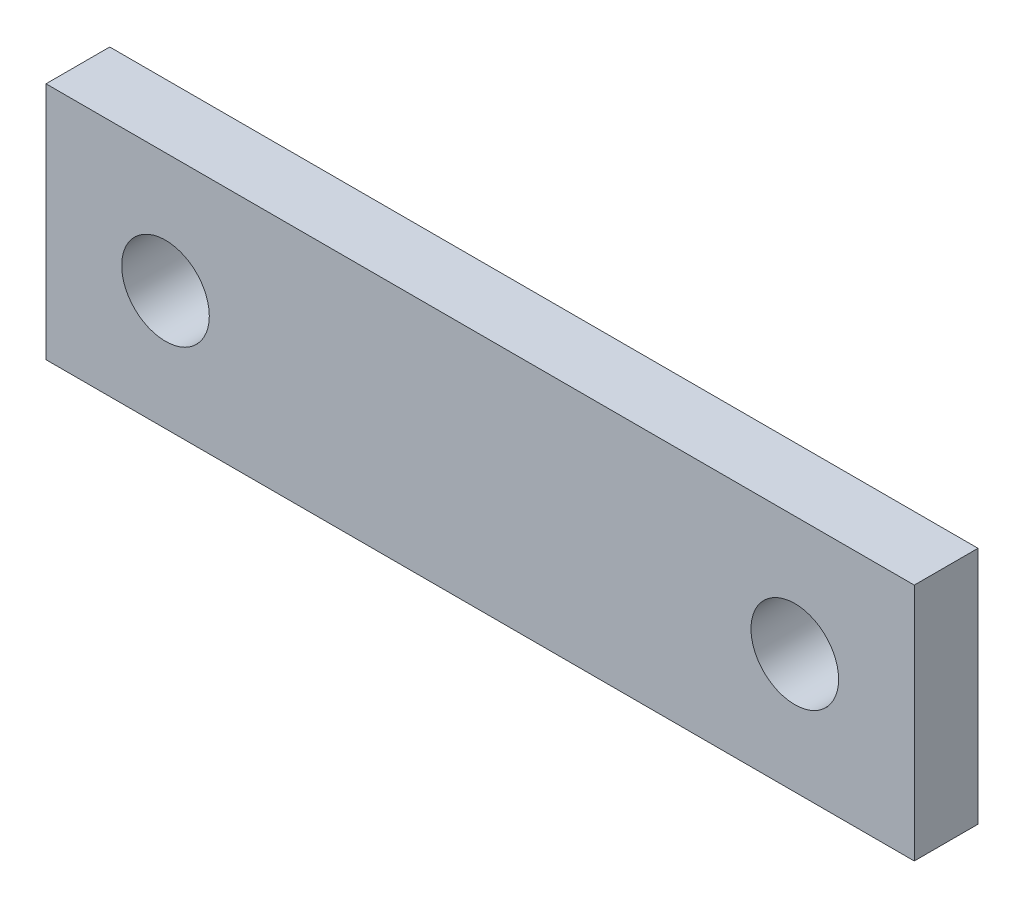
ISO-10303-21;
HEADER;
FILE_DESCRIPTION(('STEP AP214'),'2;1');
FILE_NAME('part.step','',(''),(''),'','','');
FILE_SCHEMA(('AUTOMOTIVE_DESIGN { 1 0 10303 214 1 1 1 1 }'));
ENDSEC;
DATA;
#1=APPLICATION_CONTEXT('core data for automotive mechanical design processes');
#2=APPLICATION_PROTOCOL_DEFINITION('international standard','automotive_design',2000,#1);
#3=PRODUCT_CONTEXT('',#1,'mechanical');
#4=PRODUCT('Part','Part','',(#3));
#5=PRODUCT_RELATED_PRODUCT_CATEGORY('part','',(#4));
#6=PRODUCT_DEFINITION_FORMATION('','',#4);
#7=PRODUCT_DEFINITION_CONTEXT('part definition',#1,'design');
#8=PRODUCT_DEFINITION('design','',#6,#7);
#9=PRODUCT_DEFINITION_SHAPE('','',#8);
#10=(LENGTH_UNIT() NAMED_UNIT(*) SI_UNIT(.MILLI.,.METRE.));
#11=(NAMED_UNIT(*) PLANE_ANGLE_UNIT() SI_UNIT($,.RADIAN.));
#12=(NAMED_UNIT(*) SI_UNIT($,.STERADIAN.) SOLID_ANGLE_UNIT());
#13=UNCERTAINTY_MEASURE_WITH_UNIT(LENGTH_MEASURE(1.E-05),#10,'distance_accuracy_value','');
#14=(GEOMETRIC_REPRESENTATION_CONTEXT(3) GLOBAL_UNCERTAINTY_ASSIGNED_CONTEXT((#13)) GLOBAL_UNIT_ASSIGNED_CONTEXT((#10,
#11,#12)) REPRESENTATION_CONTEXT('',''));
#15=CARTESIAN_POINT('',(0.,0.,0.));
#16=DIRECTION('',(0.,0.,1.));
#17=DIRECTION('',(1.,0.,0.));
#18=AXIS2_PLACEMENT_3D('',#15,#16,#17);
#19=CARTESIAN_POINT('',(0.,0.,16.));
#20=DIRECTION('',(1.,0.,0.));
#21=DIRECTION('',(0.,0.,-1.));
#22=AXIS2_PLACEMENT_3D('',#19,#20,#21);
#23=PLANE('',#22);
#24=DIRECTION('',(0.,-1.,0.));
#25=VECTOR('',#24,1.);
#26=CARTESIAN_POINT('',(0.,0.,0.));
#27=LINE('',#26,#25);
#28=CARTESIAN_POINT('',(0.,60.,0.));
#29=VERTEX_POINT('',#28);
#30=CARTESIAN_POINT('',(0.,0.,0.));
#31=VERTEX_POINT('',#30);
#32=EDGE_CURVE('E97',#29,#31,#27,.T.);
#33=ORIENTED_EDGE('',*,*,#32,.T.);
#34=DIRECTION('',(0.,0.,-1.));
#35=VECTOR('',#34,1.);
#36=CARTESIAN_POINT('',(0.,0.,16.));
#37=LINE('',#36,#35);
#38=CARTESIAN_POINT('',(0.,0.,16.));
#39=VERTEX_POINT('',#38);
#40=EDGE_CURVE('E11',#39,#31,#37,.T.);
#41=ORIENTED_EDGE('',*,*,#40,.F.);
#42=DIRECTION('',(0.,-1.,0.));
#43=VECTOR('',#42,1.);
#44=CARTESIAN_POINT('',(0.,0.,16.));
#45=LINE('',#44,#43);
#46=CARTESIAN_POINT('',(0.,60.,16.));
#47=VERTEX_POINT('',#46);
#48=EDGE_CURVE('E85',#47,#39,#45,.T.);
#49=ORIENTED_EDGE('',*,*,#48,.F.);
#50=DIRECTION('',(0.,0.,-1.));
#51=VECTOR('',#50,1.);
#52=CARTESIAN_POINT('',(0.,60.,16.));
#53=LINE('',#52,#51);
#54=EDGE_CURVE('E93',#47,#29,#53,.T.);
#55=ORIENTED_EDGE('',*,*,#54,.T.);
#56=EDGE_LOOP('',(#33,#41,#49,#55));
#57=FACE_BOUND('',#56,.T.);
#58=ADVANCED_FACE('F34',(#57),#23,.F.);
#59=CARTESIAN_POINT('',(0.,0.,16.));
#60=DIRECTION('',(0.,1.,0.));
#61=DIRECTION('',(0.,0.,1.));
#62=AXIS2_PLACEMENT_3D('',#59,#60,#61);
#63=PLANE('',#62);
#64=DIRECTION('',(1.,0.,0.));
#65=VECTOR('',#64,1.);
#66=CARTESIAN_POINT('',(0.,0.,0.));
#67=LINE('',#66,#65);
#68=CARTESIAN_POINT('',(218.,0.,0.));
#69=VERTEX_POINT('',#68);
#70=EDGE_CURVE('E89',#31,#69,#67,.T.);
#71=ORIENTED_EDGE('',*,*,#70,.T.);
#72=DIRECTION('',(0.,0.,-1.));
#73=VECTOR('',#72,1.);
#74=CARTESIAN_POINT('',(218.,0.,16.));
#75=LINE('',#74,#73);
#76=CARTESIAN_POINT('',(218.,0.,16.));
#77=VERTEX_POINT('',#76);
#78=EDGE_CURVE('E42',#77,#69,#75,.T.);
#79=ORIENTED_EDGE('',*,*,#78,.F.);
#80=DIRECTION('',(1.,0.,0.));
#81=VECTOR('',#80,1.);
#82=CARTESIAN_POINT('',(0.,0.,16.));
#83=LINE('',#82,#81);
#84=EDGE_CURVE('E80',#39,#77,#83,.T.);
#85=ORIENTED_EDGE('',*,*,#84,.F.);
#86=ORIENTED_EDGE('',*,*,#40,.T.);
#87=EDGE_LOOP('',(#71,#79,#85,#86));
#88=FACE_BOUND('',#87,.T.);
#89=ADVANCED_FACE('F88',(#88),#63,.F.);
#90=CARTESIAN_POINT('',(218.,0.,16.));
#91=DIRECTION('',(-1.,0.,0.));
#92=DIRECTION('',(0.,0.,1.));
#93=AXIS2_PLACEMENT_3D('',#90,#91,#92);
#94=PLANE('',#93);
#95=DIRECTION('',(0.,1.,0.));
#96=VECTOR('',#95,1.);
#97=CARTESIAN_POINT('',(218.,0.,0.));
#98=LINE('',#97,#96);
#99=CARTESIAN_POINT('',(218.,60.,0.));
#100=VERTEX_POINT('',#99);
#101=EDGE_CURVE('E67',#69,#100,#98,.T.);
#102=ORIENTED_EDGE('',*,*,#101,.T.);
#103=DIRECTION('',(0.,0.,-1.));
#104=VECTOR('',#103,1.);
#105=CARTESIAN_POINT('',(218.,60.,16.));
#106=LINE('',#105,#104);
#107=CARTESIAN_POINT('',(218.,60.,16.));
#108=VERTEX_POINT('',#107);
#109=EDGE_CURVE('E90',#108,#100,#106,.T.);
#110=ORIENTED_EDGE('',*,*,#109,.F.);
#111=DIRECTION('',(0.,1.,0.));
#112=VECTOR('',#111,1.);
#113=CARTESIAN_POINT('',(218.,0.,16.));
#114=LINE('',#113,#112);
#115=EDGE_CURVE('E83',#77,#108,#114,.T.);
#116=ORIENTED_EDGE('',*,*,#115,.F.);
#117=ORIENTED_EDGE('',*,*,#78,.T.);
#118=EDGE_LOOP('',(#102,#110,#116,#117));
#119=FACE_BOUND('',#118,.T.);
#120=ADVANCED_FACE('F91',(#119),#94,.F.);
#121=CARTESIAN_POINT('',(0.,60.,16.));
#122=DIRECTION('',(0.,-1.,0.));
#123=DIRECTION('',(0.,0.,-1.));
#124=AXIS2_PLACEMENT_3D('',#121,#122,#123);
#125=PLANE('',#124);
#126=DIRECTION('',(-1.,0.,0.));
#127=VECTOR('',#126,1.);
#128=CARTESIAN_POINT('',(0.,60.,0.));
#129=LINE('',#128,#127);
#130=EDGE_CURVE('E73',#100,#29,#129,.T.);
#131=ORIENTED_EDGE('',*,*,#130,.T.);
#132=ORIENTED_EDGE('',*,*,#54,.F.);
#133=DIRECTION('',(-1.,0.,0.));
#134=VECTOR('',#133,1.);
#135=CARTESIAN_POINT('',(0.,60.,16.));
#136=LINE('',#135,#134);
#137=EDGE_CURVE('E50',#108,#47,#136,.T.);
#138=ORIENTED_EDGE('',*,*,#137,.F.);
#139=ORIENTED_EDGE('',*,*,#109,.T.);
#140=EDGE_LOOP('',(#131,#132,#138,#139));
#141=FACE_BOUND('',#140,.T.);
#142=ADVANCED_FACE('F105',(#141),#125,.F.);
#143=CARTESIAN_POINT('',(0.,60.,16.));
#144=DIRECTION('',(0.,0.,-1.));
#145=DIRECTION('',(-1.,0.,0.));
#146=AXIS2_PLACEMENT_3D('',#143,#144,#145);
#147=PLANE('',#146);
#148=CARTESIAN_POINT('',(188.,30.,16.));
#149=DIRECTION('',(0.,0.,1.));
#150=DIRECTION('',(1.,0.,0.));
#151=AXIS2_PLACEMENT_3D('',#148,#149,#150);
#152=CIRCLE('',#151,11.);
#153=CARTESIAN_POINT('',(199.,30.,16.));
#154=VERTEX_POINT('',#153);
#155=EDGE_CURVE('E117',#154,#154,#152,.T.);
#156=ORIENTED_EDGE('',*,*,#155,.F.);
#157=EDGE_LOOP('',(#156));
#158=FACE_BOUND('',#157,.T.);
#159=CARTESIAN_POINT('',(30.,30.,16.));
#160=DIRECTION('',(0.,0.,1.));
#161=DIRECTION('',(1.,0.,0.));
#162=AXIS2_PLACEMENT_3D('',#159,#160,#161);
#163=CIRCLE('',#162,11.);
#164=CARTESIAN_POINT('',(41.,30.,16.));
#165=VERTEX_POINT('',#164);
#166=EDGE_CURVE('E111',#165,#165,#163,.T.);
#167=ORIENTED_EDGE('',*,*,#166,.F.);
#168=EDGE_LOOP('',(#167));
#169=FACE_BOUND('',#168,.T.);
#170=ORIENTED_EDGE('',*,*,#48,.T.);
#171=ORIENTED_EDGE('',*,*,#84,.T.);
#172=ORIENTED_EDGE('',*,*,#115,.T.);
#173=ORIENTED_EDGE('',*,*,#137,.T.);
#174=EDGE_LOOP('',(#170,#171,#172,#173));
#175=FACE_BOUND('',#174,.T.);
#176=ADVANCED_FACE('F81',(#158,#169,#175),#147,.F.);
#177=CARTESIAN_POINT('',(0.,60.,0.));
#178=DIRECTION('',(0.,0.,-1.));
#179=DIRECTION('',(-1.,0.,0.));
#180=AXIS2_PLACEMENT_3D('',#177,#178,#179);
#181=PLANE('',#180);
#182=CARTESIAN_POINT('',(188.,30.,0.));
#183=DIRECTION('',(0.,0.,1.));
#184=DIRECTION('',(1.,0.,0.));
#185=AXIS2_PLACEMENT_3D('',#182,#183,#184);
#186=CIRCLE('',#185,11.);
#187=CARTESIAN_POINT('',(199.,30.,0.));
#188=VERTEX_POINT('',#187);
#189=EDGE_CURVE('E114',#188,#188,#186,.T.);
#190=ORIENTED_EDGE('',*,*,#189,.T.);
#191=EDGE_LOOP('',(#190));
#192=FACE_BOUND('',#191,.T.);
#193=CARTESIAN_POINT('',(30.,30.,0.));
#194=DIRECTION('',(0.,0.,1.));
#195=DIRECTION('',(1.,0.,0.));
#196=AXIS2_PLACEMENT_3D('',#193,#194,#195);
#197=CIRCLE('',#196,11.);
#198=CARTESIAN_POINT('',(41.,30.,0.));
#199=VERTEX_POINT('',#198);
#200=EDGE_CURVE('E100',#199,#199,#197,.T.);
#201=ORIENTED_EDGE('',*,*,#200,.T.);
#202=EDGE_LOOP('',(#201));
#203=FACE_BOUND('',#202,.T.);
#204=ORIENTED_EDGE('',*,*,#32,.F.);
#205=ORIENTED_EDGE('',*,*,#130,.F.);
#206=ORIENTED_EDGE('',*,*,#101,.F.);
#207=ORIENTED_EDGE('',*,*,#70,.F.);
#208=EDGE_LOOP('',(#204,#205,#206,#207));
#209=FACE_BOUND('',#208,.T.);
#210=ADVANCED_FACE('F108',(#192,#203,#209),#181,.T.);
#211=CARTESIAN_POINT('',(30.,30.,0.));
#212=DIRECTION('',(0.,0.,1.));
#213=DIRECTION('',(1.,0.,0.));
#214=AXIS2_PLACEMENT_3D('',#211,#212,#213);
#215=CYLINDRICAL_SURFACE('',#214,11.);
#216=ORIENTED_EDGE('',*,*,#200,.F.);
#217=EDGE_LOOP('',(#216));
#218=FACE_BOUND('',#217,.T.);
#219=ORIENTED_EDGE('',*,*,#166,.T.);
#220=EDGE_LOOP('',(#219));
#221=FACE_BOUND('',#220,.T.);
#222=ADVANCED_FACE('F128',(#218,#221),#215,.F.);
#223=CARTESIAN_POINT('',(188.,30.,0.));
#224=DIRECTION('',(0.,0.,1.));
#225=DIRECTION('',(1.,0.,0.));
#226=AXIS2_PLACEMENT_3D('',#223,#224,#225);
#227=CYLINDRICAL_SURFACE('',#226,11.);
#228=ORIENTED_EDGE('',*,*,#189,.F.);
#229=EDGE_LOOP('',(#228));
#230=FACE_BOUND('',#229,.T.);
#231=ORIENTED_EDGE('',*,*,#155,.T.);
#232=EDGE_LOOP('',(#231));
#233=FACE_BOUND('',#232,.T.);
#234=ADVANCED_FACE('F125',(#230,#233),#227,.F.);
#235=CLOSED_SHELL('',(#58,#89,#120,#142,#176,#210,#222,#234));
#236=MANIFOLD_SOLID_BREP('B2',#235);
#237=ADVANCED_BREP_SHAPE_REPRESENTATION('',(#18,#236),#14);
#238=SHAPE_DEFINITION_REPRESENTATION(#9,#237);
ENDSEC;
END-ISO-10303-21;
